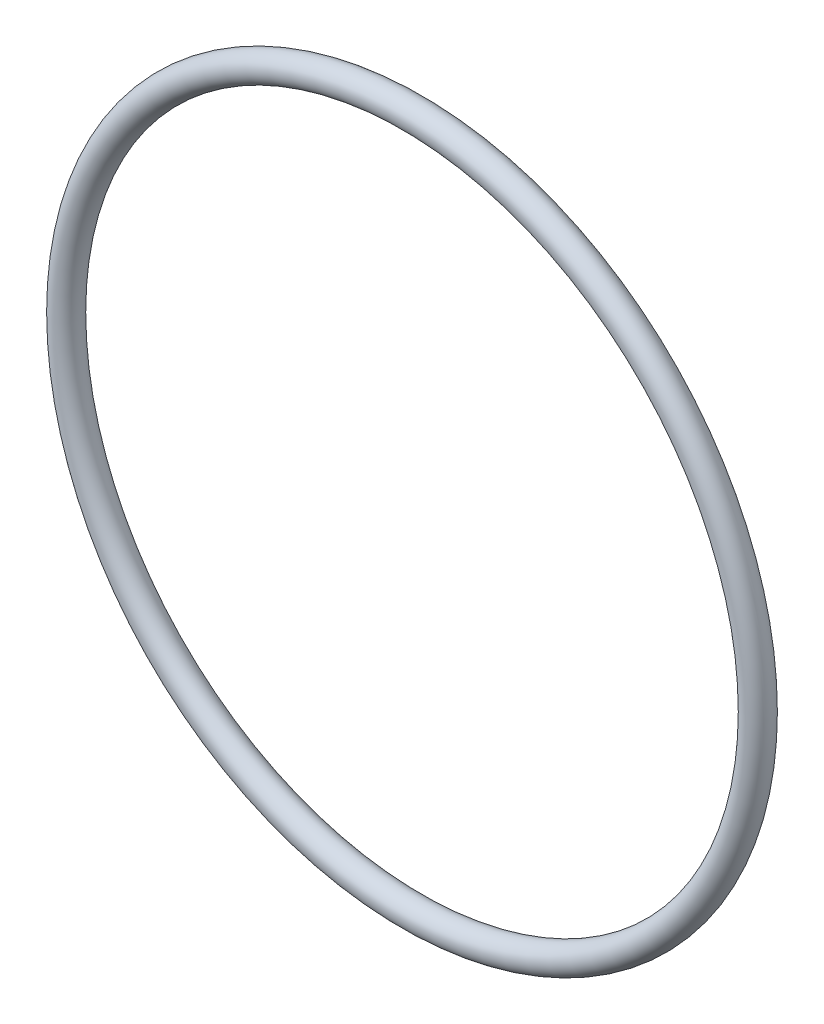
ISO-10303-21;
HEADER;
FILE_DESCRIPTION(('STEP AP214'),'2;1');
FILE_NAME('part.step','',(''),(''),'','','');
FILE_SCHEMA(('AUTOMOTIVE_DESIGN { 1 0 10303 214 1 1 1 1 }'));
ENDSEC;
DATA;
#1=APPLICATION_CONTEXT('core data for automotive mechanical design processes');
#2=APPLICATION_PROTOCOL_DEFINITION('international standard','automotive_design',2000,#1);
#3=PRODUCT_CONTEXT('',#1,'mechanical');
#4=PRODUCT('Part','Part','',(#3));
#5=PRODUCT_RELATED_PRODUCT_CATEGORY('part','',(#4));
#6=PRODUCT_DEFINITION_FORMATION('','',#4);
#7=PRODUCT_DEFINITION_CONTEXT('part definition',#1,'design');
#8=PRODUCT_DEFINITION('design','',#6,#7);
#9=PRODUCT_DEFINITION_SHAPE('','',#8);
#10=(LENGTH_UNIT() NAMED_UNIT(*) SI_UNIT(.MILLI.,.METRE.));
#11=(NAMED_UNIT(*) PLANE_ANGLE_UNIT() SI_UNIT($,.RADIAN.));
#12=(NAMED_UNIT(*) SI_UNIT($,.STERADIAN.) SOLID_ANGLE_UNIT());
#13=UNCERTAINTY_MEASURE_WITH_UNIT(LENGTH_MEASURE(1.E-05),#10,'distance_accuracy_value','');
#14=(GEOMETRIC_REPRESENTATION_CONTEXT(3) GLOBAL_UNCERTAINTY_ASSIGNED_CONTEXT((#13)) GLOBAL_UNIT_ASSIGNED_CONTEXT((#10,
#11,#12)) REPRESENTATION_CONTEXT('',''));
#15=CARTESIAN_POINT('',(0.,0.,0.));
#16=DIRECTION('',(0.,0.,1.));
#17=DIRECTION('',(1.,0.,0.));
#18=AXIS2_PLACEMENT_3D('',#15,#16,#17);
#19=CARTESIAN_POINT('',(0.,0.,0.));
#20=DIRECTION('',(0.,0.,1.));
#21=DIRECTION('',(1.,0.,0.));
#22=AXIS2_PLACEMENT_3D('',#19,#20,#21);
#23=TOROIDAL_SURFACE('',#22,38.1,1.524);
#24=CARTESIAN_POINT('',(38.1,0.,0.));
#25=DIRECTION('',(0.,1.,0.));
#26=DIRECTION('',(-1.,0.,0.));
#27=AXIS2_PLACEMENT_3D('',#24,#25,#26);
#28=CIRCLE('',#27,1.524);
#29=CARTESIAN_POINT('',(39.624,0.,0.));
#30=VERTEX_POINT('',#29);
#31=EDGE_CURVE('E11',#30,#30,#28,.T.);
#32=CARTESIAN_POINT('',(0.,0.,0.));
#33=DIRECTION('',(0.,0.,1.));
#34=DIRECTION('',(1.,0.,0.));
#35=AXIS2_PLACEMENT_3D('',#32,#33,#34);
#36=CIRCLE('',#35,39.624);
#37=EDGE_CURVE('',#30,#30,#36,.T.);
#38=ORIENTED_EDGE('',*,*,#31,.T.);
#39=ORIENTED_EDGE('',*,*,#31,.F.);
#40=ORIENTED_EDGE('',*,*,#37,.T.);
#41=ORIENTED_EDGE('',*,*,#37,.F.);
#42=EDGE_LOOP('',(#38,#40,#39,#41));
#43=FACE_BOUND('',#42,.T.);
#44=ADVANCED_FACE('F51',(#43),#23,.T.);
#45=CLOSED_SHELL('',(#44));
#46=MANIFOLD_SOLID_BREP('B2',#45);
#47=ADVANCED_BREP_SHAPE_REPRESENTATION('',(#18,#46),#14);
#48=SHAPE_DEFINITION_REPRESENTATION(#9,#47);
ENDSEC;
END-ISO-10303-21;
